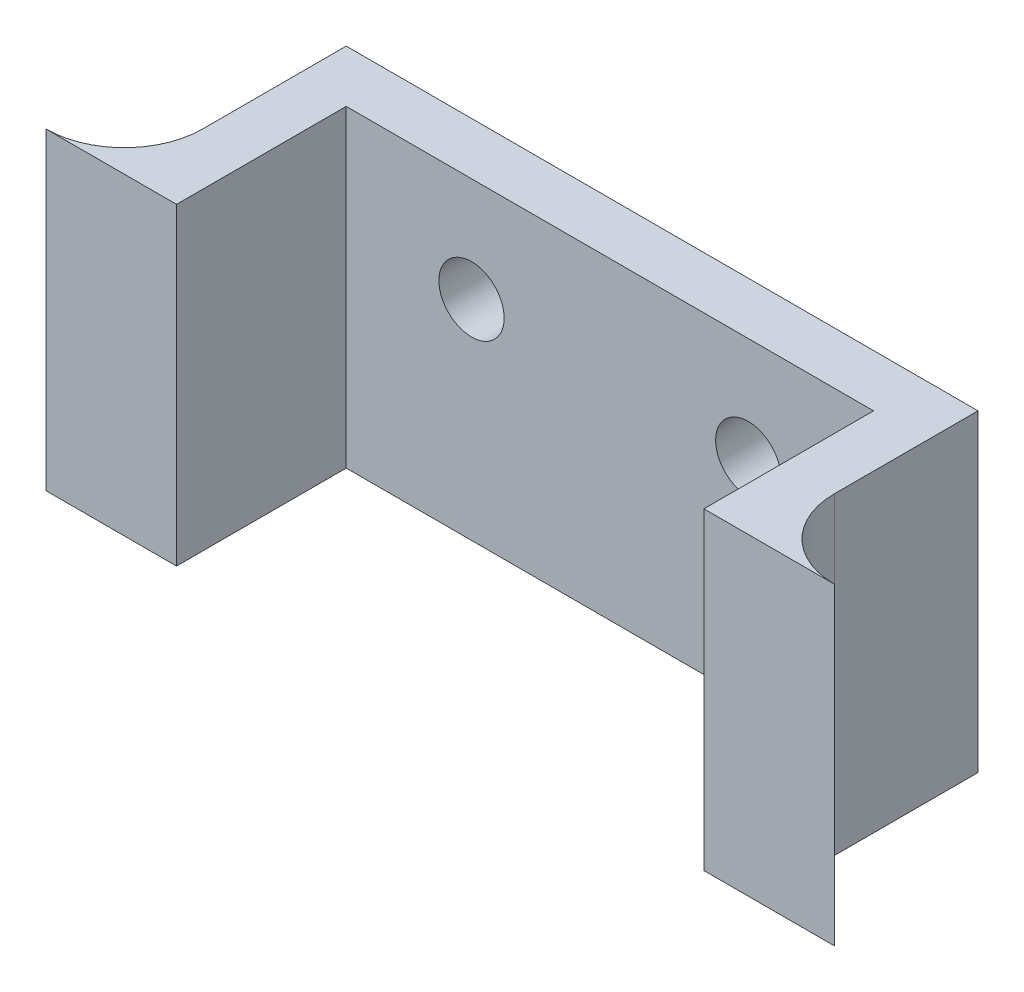
ISO-10303-21;
HEADER;
FILE_DESCRIPTION(('STEP AP214'),'2;1');
FILE_NAME('part.step','',(''),(''),'','','');
FILE_SCHEMA(('AUTOMOTIVE_DESIGN { 1 0 10303 214 1 1 1 1 }'));
ENDSEC;
DATA;
#1=APPLICATION_CONTEXT('core data for automotive mechanical design processes');
#2=APPLICATION_PROTOCOL_DEFINITION('international standard','automotive_design',2000,#1);
#3=PRODUCT_CONTEXT('',#1,'mechanical');
#4=PRODUCT('Part','Part','',(#3));
#5=PRODUCT_RELATED_PRODUCT_CATEGORY('part','',(#4));
#6=PRODUCT_DEFINITION_FORMATION('','',#4);
#7=PRODUCT_DEFINITION_CONTEXT('part definition',#1,'design');
#8=PRODUCT_DEFINITION('design','',#6,#7);
#9=PRODUCT_DEFINITION_SHAPE('','',#8);
#10=(LENGTH_UNIT() NAMED_UNIT(*) SI_UNIT(.MILLI.,.METRE.));
#11=(NAMED_UNIT(*) PLANE_ANGLE_UNIT() SI_UNIT($,.RADIAN.));
#12=(NAMED_UNIT(*) SI_UNIT($,.STERADIAN.) SOLID_ANGLE_UNIT());
#13=UNCERTAINTY_MEASURE_WITH_UNIT(LENGTH_MEASURE(1.E-05),#10,'distance_accuracy_value','');
#14=(GEOMETRIC_REPRESENTATION_CONTEXT(3) GLOBAL_UNCERTAINTY_ASSIGNED_CONTEXT((#13)) GLOBAL_UNIT_ASSIGNED_CONTEXT((#10,
#11,#12)) REPRESENTATION_CONTEXT('',''));
#15=CARTESIAN_POINT('',(0.,0.,0.));
#16=DIRECTION('',(0.,0.,1.));
#17=DIRECTION('',(1.,0.,0.));
#18=AXIS2_PLACEMENT_3D('',#15,#16,#17);
#19=CARTESIAN_POINT('',(10.1,12.,-3.25));
#20=DIRECTION('',(0.,0.,-1.));
#21=DIRECTION('',(-1.,0.,0.));
#22=AXIS2_PLACEMENT_3D('',#19,#20,#21);
#23=PLANE('',#22);
#24=CARTESIAN_POINT('',(5.3,8.,-3.25));
#25=DIRECTION('',(0.,0.,-1.));
#26=DIRECTION('',(-1.,0.,0.));
#27=AXIS2_PLACEMENT_3D('',#24,#25,#26);
#28=CIRCLE('',#27,1.25);
#29=CARTESIAN_POINT('',(4.05,8.,-3.25));
#30=VERTEX_POINT('',#29);
#31=EDGE_CURVE('E151',#30,#30,#28,.F.);
#32=ORIENTED_EDGE('',*,*,#31,.F.);
#33=EDGE_LOOP('',(#32));
#34=FACE_BOUND('',#33,.T.);
#35=CARTESIAN_POINT('',(-5.3,8.,-3.25));
#36=DIRECTION('',(0.,0.,-1.));
#37=DIRECTION('',(-1.,0.,0.));
#38=AXIS2_PLACEMENT_3D('',#35,#36,#37);
#39=CIRCLE('',#38,1.25);
#40=CARTESIAN_POINT('',(-6.55,8.,-3.25));
#41=VERTEX_POINT('',#40);
#42=EDGE_CURVE('E219',#41,#41,#39,.F.);
#43=ORIENTED_EDGE('',*,*,#42,.F.);
#44=EDGE_LOOP('',(#43));
#45=FACE_BOUND('',#44,.T.);
#46=DIRECTION('',(1.,0.,0.));
#47=VECTOR('',#46,1.);
#48=CARTESIAN_POINT('',(10.1,0.,-3.25));
#49=LINE('',#48,#47);
#50=CARTESIAN_POINT('',(-10.1,0.,-3.25));
#51=VERTEX_POINT('',#50);
#52=CARTESIAN_POINT('',(10.1,0.,-3.25));
#53=VERTEX_POINT('',#52);
#54=EDGE_CURVE('E147',#51,#53,#49,.T.);
#55=ORIENTED_EDGE('',*,*,#54,.T.);
#56=DIRECTION('',(0.,-1.,0.));
#57=VECTOR('',#56,1.);
#58=CARTESIAN_POINT('',(10.1,12.,-3.25));
#59=LINE('',#58,#57);
#60=CARTESIAN_POINT('',(10.1,12.,-3.25));
#61=VERTEX_POINT('',#60);
#62=EDGE_CURVE('E11',#61,#53,#59,.T.);
#63=ORIENTED_EDGE('',*,*,#62,.F.);
#64=DIRECTION('',(1.,0.,0.));
#65=VECTOR('',#64,1.);
#66=CARTESIAN_POINT('',(10.1,12.,-3.25));
#67=LINE('',#66,#65);
#68=CARTESIAN_POINT('',(-10.1,12.,-3.25));
#69=VERTEX_POINT('',#68);
#70=EDGE_CURVE('E167',#69,#61,#67,.T.);
#71=ORIENTED_EDGE('',*,*,#70,.F.);
#72=DIRECTION('',(0.,-1.,0.));
#73=VECTOR('',#72,1.);
#74=CARTESIAN_POINT('',(-10.1,12.,-3.25));
#75=LINE('',#74,#73);
#76=EDGE_CURVE('E143',#69,#51,#75,.T.);
#77=ORIENTED_EDGE('',*,*,#76,.T.);
#78=EDGE_LOOP('',(#55,#63,#71,#77));
#79=FACE_BOUND('',#78,.T.);
#80=ADVANCED_FACE('F39',(#34,#45,#79),#23,.F.);
#81=CARTESIAN_POINT('',(10.1,12.,3.25));
#82=DIRECTION('',(1.,0.,0.));
#83=DIRECTION('',(0.,0.,-1.));
#84=AXIS2_PLACEMENT_3D('',#81,#82,#83);
#85=PLANE('',#84);
#86=DIRECTION('',(0.,0.,1.));
#87=VECTOR('',#86,1.);
#88=CARTESIAN_POINT('',(10.1,0.,3.25));
#89=LINE('',#88,#87);
#90=CARTESIAN_POINT('',(10.1,0.,3.25));
#91=VERTEX_POINT('',#90);
#92=EDGE_CURVE('E150',#53,#91,#89,.T.);
#93=ORIENTED_EDGE('',*,*,#92,.T.);
#94=DIRECTION('',(0.,-1.,0.));
#95=VECTOR('',#94,1.);
#96=CARTESIAN_POINT('',(10.1,12.,3.25));
#97=LINE('',#96,#95);
#98=CARTESIAN_POINT('',(10.1,12.,3.25));
#99=VERTEX_POINT('',#98);
#100=EDGE_CURVE('E47',#99,#91,#97,.T.);
#101=ORIENTED_EDGE('',*,*,#100,.F.);
#102=DIRECTION('',(0.,0.,1.));
#103=VECTOR('',#102,1.);
#104=CARTESIAN_POINT('',(10.1,12.,3.25));
#105=LINE('',#104,#103);
#106=EDGE_CURVE('E103',#61,#99,#105,.T.);
#107=ORIENTED_EDGE('',*,*,#106,.F.);
#108=ORIENTED_EDGE('',*,*,#62,.T.);
#109=EDGE_LOOP('',(#93,#101,#107,#108));
#110=FACE_BOUND('',#109,.T.);
#111=ADVANCED_FACE('F188',(#110),#85,.F.);
#112=CARTESIAN_POINT('',(12.1,12.,3.25));
#113=DIRECTION('',(0.,0.,-1.));
#114=DIRECTION('',(-1.,0.,0.));
#115=AXIS2_PLACEMENT_3D('',#112,#113,#114);
#116=PLANE('',#115);
#117=DIRECTION('',(1.,0.,0.));
#118=VECTOR('',#117,1.);
#119=CARTESIAN_POINT('',(12.1,0.,3.25));
#120=LINE('',#119,#118);
#121=CARTESIAN_POINT('',(15.1,0.,3.25));
#122=VERTEX_POINT('',#121);
#123=EDGE_CURVE('E154',#91,#122,#120,.T.);
#124=ORIENTED_EDGE('',*,*,#123,.T.);
#125=DIRECTION('',(0.,-1.,0.));
#126=VECTOR('',#125,1.);
#127=CARTESIAN_POINT('',(15.1,12.,3.25));
#128=LINE('',#127,#126);
#129=CARTESIAN_POINT('',(15.1,12.,3.25));
#130=VERTEX_POINT('',#129);
#131=EDGE_CURVE('E180',#130,#122,#128,.T.);
#132=ORIENTED_EDGE('',*,*,#131,.F.);
#133=DIRECTION('',(1.,0.,0.));
#134=VECTOR('',#133,1.);
#135=CARTESIAN_POINT('',(12.1,12.,3.25));
#136=LINE('',#135,#134);
#137=EDGE_CURVE('E187',#99,#130,#136,.T.);
#138=ORIENTED_EDGE('',*,*,#137,.F.);
#139=ORIENTED_EDGE('',*,*,#100,.T.);
#140=EDGE_LOOP('',(#124,#132,#138,#139));
#141=FACE_BOUND('',#140,.T.);
#142=ADVANCED_FACE('F185',(#141),#116,.F.);
#143=CARTESIAN_POINT('',(15.1,12.,0.25));
#144=DIRECTION('',(0.,-1.,0.));
#145=DIRECTION('',(0.,0.,-1.));
#146=AXIS2_PLACEMENT_3D('',#143,#144,#145);
#147=CYLINDRICAL_SURFACE('',#146,3.);
#148=CARTESIAN_POINT('',(15.1,0.,0.25));
#149=DIRECTION('',(0.,-1.,0.));
#150=DIRECTION('',(0.,0.,-1.));
#151=AXIS2_PLACEMENT_3D('',#148,#149,#150);
#152=CIRCLE('',#151,3.);
#153=CARTESIAN_POINT('',(12.1,0.,0.249999999999978));
#154=VERTEX_POINT('',#153);
#155=EDGE_CURVE('E156',#122,#154,#152,.T.);
#156=ORIENTED_EDGE('',*,*,#155,.T.);
#157=DIRECTION('',(0.,-1.,0.));
#158=VECTOR('',#157,1.);
#159=CARTESIAN_POINT('',(12.1,12.,0.249999999999978));
#160=LINE('',#159,#158);
#161=CARTESIAN_POINT('',(12.1,12.,0.249999999999978));
#162=VERTEX_POINT('',#161);
#163=EDGE_CURVE('E177',#162,#154,#160,.T.);
#164=ORIENTED_EDGE('',*,*,#163,.F.);
#165=CARTESIAN_POINT('',(15.1,12.,0.25));
#166=DIRECTION('',(0.,-1.,0.));
#167=DIRECTION('',(0.,0.,-1.));
#168=AXIS2_PLACEMENT_3D('',#165,#166,#167);
#169=CIRCLE('',#168,3.);
#170=EDGE_CURVE('E207',#130,#162,#169,.T.);
#171=ORIENTED_EDGE('',*,*,#170,.F.);
#172=ORIENTED_EDGE('',*,*,#131,.T.);
#173=EDGE_LOOP('',(#156,#164,#171,#172));
#174=FACE_BOUND('',#173,.T.);
#175=ADVANCED_FACE('F198',(#174),#147,.F.);
#176=CARTESIAN_POINT('',(12.1,12.,-5.25));
#177=DIRECTION('',(-1.,0.,0.));
#178=DIRECTION('',(0.,0.,1.));
#179=AXIS2_PLACEMENT_3D('',#176,#177,#178);
#180=PLANE('',#179);
#181=DIRECTION('',(0.,0.,-1.));
#182=VECTOR('',#181,1.);
#183=CARTESIAN_POINT('',(12.1,0.,-5.25));
#184=LINE('',#183,#182);
#185=CARTESIAN_POINT('',(12.1,0.,-5.25));
#186=VERTEX_POINT('',#185);
#187=EDGE_CURVE('E158',#154,#186,#184,.T.);
#188=ORIENTED_EDGE('',*,*,#187,.T.);
#189=DIRECTION('',(0.,-1.,0.));
#190=VECTOR('',#189,1.);
#191=CARTESIAN_POINT('',(12.1,12.,-5.25));
#192=LINE('',#191,#190);
#193=CARTESIAN_POINT('',(12.1,12.,-5.25));
#194=VERTEX_POINT('',#193);
#195=EDGE_CURVE('E174',#194,#186,#192,.T.);
#196=ORIENTED_EDGE('',*,*,#195,.F.);
#197=DIRECTION('',(0.,0.,-1.));
#198=VECTOR('',#197,1.);
#199=CARTESIAN_POINT('',(12.1,12.,-5.25));
#200=LINE('',#199,#198);
#201=EDGE_CURVE('E204',#162,#194,#200,.T.);
#202=ORIENTED_EDGE('',*,*,#201,.F.);
#203=ORIENTED_EDGE('',*,*,#163,.T.);
#204=EDGE_LOOP('',(#188,#196,#202,#203));
#205=FACE_BOUND('',#204,.T.);
#206=ADVANCED_FACE('F202',(#205),#180,.F.);
#207=CARTESIAN_POINT('',(-12.1,12.,-5.25));
#208=DIRECTION('',(0.,0.,1.));
#209=DIRECTION('',(1.,0.,0.));
#210=AXIS2_PLACEMENT_3D('',#207,#208,#209);
#211=PLANE('',#210);
#212=CARTESIAN_POINT('',(5.3,8.,-5.25));
#213=DIRECTION('',(0.,0.,-1.));
#214=DIRECTION('',(-1.,0.,0.));
#215=AXIS2_PLACEMENT_3D('',#212,#213,#214);
#216=CIRCLE('',#215,1.25);
#217=CARTESIAN_POINT('',(4.05,8.,-5.25));
#218=VERTEX_POINT('',#217);
#219=EDGE_CURVE('E218',#218,#218,#216,.T.);
#220=ORIENTED_EDGE('',*,*,#219,.F.);
#221=EDGE_LOOP('',(#220));
#222=FACE_BOUND('',#221,.T.);
#223=CARTESIAN_POINT('',(-5.3,8.,-5.25));
#224=DIRECTION('',(0.,0.,-1.));
#225=DIRECTION('',(1.,0.,0.));
#226=AXIS2_PLACEMENT_3D('',#223,#224,#225);
#227=CIRCLE('',#226,1.25);
#228=CARTESIAN_POINT('',(-4.05,8.,-5.25));
#229=VERTEX_POINT('',#228);
#230=EDGE_CURVE('E215',#229,#229,#227,.T.);
#231=ORIENTED_EDGE('',*,*,#230,.F.);
#232=EDGE_LOOP('',(#231));
#233=FACE_BOUND('',#232,.T.);
#234=DIRECTION('',(-1.,0.,0.));
#235=VECTOR('',#234,1.);
#236=CARTESIAN_POINT('',(-12.1,0.,-5.25));
#237=LINE('',#236,#235);
#238=CARTESIAN_POINT('',(-12.1,0.,-5.25));
#239=VERTEX_POINT('',#238);
#240=EDGE_CURVE('E160',#186,#239,#237,.T.);
#241=ORIENTED_EDGE('',*,*,#240,.T.);
#242=DIRECTION('',(0.,-1.,0.));
#243=VECTOR('',#242,1.);
#244=CARTESIAN_POINT('',(-12.1,12.,-5.25));
#245=LINE('',#244,#243);
#246=CARTESIAN_POINT('',(-12.1,12.,-5.25));
#247=VERTEX_POINT('',#246);
#248=EDGE_CURVE('E171',#247,#239,#245,.T.);
#249=ORIENTED_EDGE('',*,*,#248,.F.);
#250=DIRECTION('',(-1.,0.,0.));
#251=VECTOR('',#250,1.);
#252=CARTESIAN_POINT('',(-12.1,12.,-5.25));
#253=LINE('',#252,#251);
#254=EDGE_CURVE('E206',#194,#247,#253,.T.);
#255=ORIENTED_EDGE('',*,*,#254,.F.);
#256=ORIENTED_EDGE('',*,*,#195,.T.);
#257=EDGE_LOOP('',(#241,#249,#255,#256));
#258=FACE_BOUND('',#257,.T.);
#259=ADVANCED_FACE('F230',(#222,#233,#258),#211,.F.);
#260=CARTESIAN_POINT('',(-12.1,12.,-5.25));
#261=DIRECTION('',(1.,0.,0.));
#262=DIRECTION('',(0.,0.,-1.));
#263=AXIS2_PLACEMENT_3D('',#260,#261,#262);
#264=PLANE('',#263);
#265=DIRECTION('',(0.,0.,1.));
#266=VECTOR('',#265,1.);
#267=CARTESIAN_POINT('',(-12.1,0.,-5.25));
#268=LINE('',#267,#266);
#269=CARTESIAN_POINT('',(-12.1,0.,0.249999999999979));
#270=VERTEX_POINT('',#269);
#271=EDGE_CURVE('E162',#239,#270,#268,.T.);
#272=ORIENTED_EDGE('',*,*,#271,.T.);
#273=DIRECTION('',(0.,-1.,0.));
#274=VECTOR('',#273,1.);
#275=CARTESIAN_POINT('',(-12.1,12.,0.249999999999979));
#276=LINE('',#275,#274);
#277=CARTESIAN_POINT('',(-12.1,12.,0.249999999999979));
#278=VERTEX_POINT('',#277);
#279=EDGE_CURVE('E138',#278,#270,#276,.T.);
#280=ORIENTED_EDGE('',*,*,#279,.F.);
#281=DIRECTION('',(0.,0.,1.));
#282=VECTOR('',#281,1.);
#283=CARTESIAN_POINT('',(-12.1,12.,-5.25));
#284=LINE('',#283,#282);
#285=EDGE_CURVE('E128',#247,#278,#284,.T.);
#286=ORIENTED_EDGE('',*,*,#285,.F.);
#287=ORIENTED_EDGE('',*,*,#248,.T.);
#288=EDGE_LOOP('',(#272,#280,#286,#287));
#289=FACE_BOUND('',#288,.T.);
#290=ADVANCED_FACE('F233',(#289),#264,.F.);
#291=CARTESIAN_POINT('',(-15.1,12.,0.25));
#292=DIRECTION('',(0.,-1.,0.));
#293=DIRECTION('',(0.,0.,-1.));
#294=AXIS2_PLACEMENT_3D('',#291,#292,#293);
#295=CYLINDRICAL_SURFACE('',#294,3.);
#296=CARTESIAN_POINT('',(-15.1,0.,0.25));
#297=DIRECTION('',(0.,-1.,0.));
#298=DIRECTION('',(0.,0.,-1.));
#299=AXIS2_PLACEMENT_3D('',#296,#297,#298);
#300=CIRCLE('',#299,3.);
#301=CARTESIAN_POINT('',(-15.1,0.,3.25));
#302=VERTEX_POINT('',#301);
#303=EDGE_CURVE('E137',#270,#302,#300,.T.);
#304=ORIENTED_EDGE('',*,*,#303,.T.);
#305=DIRECTION('',(0.,-1.,0.));
#306=VECTOR('',#305,1.);
#307=CARTESIAN_POINT('',(-15.1,12.,3.25));
#308=LINE('',#307,#306);
#309=CARTESIAN_POINT('',(-15.1,12.,3.25));
#310=VERTEX_POINT('',#309);
#311=EDGE_CURVE('E134',#310,#302,#308,.T.);
#312=ORIENTED_EDGE('',*,*,#311,.F.);
#313=CARTESIAN_POINT('',(-15.1,12.,0.25));
#314=DIRECTION('',(0.,-1.,0.));
#315=DIRECTION('',(0.,0.,-1.));
#316=AXIS2_PLACEMENT_3D('',#313,#314,#315);
#317=CIRCLE('',#316,3.);
#318=EDGE_CURVE('E122',#278,#310,#317,.T.);
#319=ORIENTED_EDGE('',*,*,#318,.F.);
#320=ORIENTED_EDGE('',*,*,#279,.T.);
#321=EDGE_LOOP('',(#304,#312,#319,#320));
#322=FACE_BOUND('',#321,.T.);
#323=ADVANCED_FACE('F135',(#322),#295,.F.);
#324=CARTESIAN_POINT('',(-12.1,12.,3.25));
#325=DIRECTION('',(0.,0.,-1.));
#326=DIRECTION('',(-1.,0.,0.));
#327=AXIS2_PLACEMENT_3D('',#324,#325,#326);
#328=PLANE('',#327);
#329=DIRECTION('',(1.,0.,0.));
#330=VECTOR('',#329,1.);
#331=CARTESIAN_POINT('',(-12.1,0.,3.25));
#332=LINE('',#331,#330);
#333=CARTESIAN_POINT('',(-10.1,0.,3.25));
#334=VERTEX_POINT('',#333);
#335=EDGE_CURVE('E89',#302,#334,#332,.T.);
#336=ORIENTED_EDGE('',*,*,#335,.T.);
#337=DIRECTION('',(0.,-1.,0.));
#338=VECTOR('',#337,1.);
#339=CARTESIAN_POINT('',(-10.1,12.,3.25));
#340=LINE('',#339,#338);
#341=CARTESIAN_POINT('',(-10.1,12.,3.25));
#342=VERTEX_POINT('',#341);
#343=EDGE_CURVE('E139',#342,#334,#340,.T.);
#344=ORIENTED_EDGE('',*,*,#343,.F.);
#345=DIRECTION('',(1.,0.,0.));
#346=VECTOR('',#345,1.);
#347=CARTESIAN_POINT('',(-15.1,12.,3.25));
#348=LINE('',#347,#346);
#349=EDGE_CURVE('E126',#310,#342,#348,.T.);
#350=ORIENTED_EDGE('',*,*,#349,.F.);
#351=ORIENTED_EDGE('',*,*,#311,.T.);
#352=EDGE_LOOP('',(#336,#344,#350,#351));
#353=FACE_BOUND('',#352,.T.);
#354=ADVANCED_FACE('F141',(#353),#328,.F.);
#355=CARTESIAN_POINT('',(-10.1,12.,-3.25));
#356=DIRECTION('',(-1.,0.,0.));
#357=DIRECTION('',(0.,0.,1.));
#358=AXIS2_PLACEMENT_3D('',#355,#356,#357);
#359=PLANE('',#358);
#360=DIRECTION('',(0.,0.,-1.));
#361=VECTOR('',#360,1.);
#362=CARTESIAN_POINT('',(-10.1,0.,-3.25));
#363=LINE('',#362,#361);
#364=EDGE_CURVE('E95',#334,#51,#363,.T.);
#365=ORIENTED_EDGE('',*,*,#364,.T.);
#366=ORIENTED_EDGE('',*,*,#76,.F.);
#367=DIRECTION('',(0.,0.,-1.));
#368=VECTOR('',#367,1.);
#369=CARTESIAN_POINT('',(-10.1,12.,-3.25));
#370=LINE('',#369,#368);
#371=EDGE_CURVE('E55',#342,#69,#370,.T.);
#372=ORIENTED_EDGE('',*,*,#371,.F.);
#373=ORIENTED_EDGE('',*,*,#343,.T.);
#374=EDGE_LOOP('',(#365,#366,#372,#373));
#375=FACE_BOUND('',#374,.T.);
#376=ADVANCED_FACE('F256',(#375),#359,.F.);
#377=CARTESIAN_POINT('',(-15.1,12.,0.25));
#378=DIRECTION('',(0.,-1.,0.));
#379=DIRECTION('',(0.,0.,-1.));
#380=AXIS2_PLACEMENT_3D('',#377,#378,#379);
#381=PLANE('',#380);
#382=ORIENTED_EDGE('',*,*,#70,.T.);
#383=ORIENTED_EDGE('',*,*,#106,.T.);
#384=ORIENTED_EDGE('',*,*,#137,.T.);
#385=ORIENTED_EDGE('',*,*,#170,.T.);
#386=ORIENTED_EDGE('',*,*,#201,.T.);
#387=ORIENTED_EDGE('',*,*,#254,.T.);
#388=ORIENTED_EDGE('',*,*,#285,.T.);
#389=ORIENTED_EDGE('',*,*,#318,.T.);
#390=ORIENTED_EDGE('',*,*,#349,.T.);
#391=ORIENTED_EDGE('',*,*,#371,.T.);
#392=EDGE_LOOP('',(#382,#383,#384,#385,#386,#387,#388,#389,#390,#391));
#393=FACE_BOUND('',#392,.T.);
#394=ADVANCED_FACE('F124',(#393),#381,.F.);
#395=CARTESIAN_POINT('',(-15.1,0.,0.25));
#396=DIRECTION('',(0.,-1.,0.));
#397=DIRECTION('',(0.,0.,-1.));
#398=AXIS2_PLACEMENT_3D('',#395,#396,#397);
#399=PLANE('',#398);
#400=ORIENTED_EDGE('',*,*,#54,.F.);
#401=ORIENTED_EDGE('',*,*,#364,.F.);
#402=ORIENTED_EDGE('',*,*,#335,.F.);
#403=ORIENTED_EDGE('',*,*,#303,.F.);
#404=ORIENTED_EDGE('',*,*,#271,.F.);
#405=ORIENTED_EDGE('',*,*,#240,.F.);
#406=ORIENTED_EDGE('',*,*,#187,.F.);
#407=ORIENTED_EDGE('',*,*,#155,.F.);
#408=ORIENTED_EDGE('',*,*,#123,.F.);
#409=ORIENTED_EDGE('',*,*,#92,.F.);
#410=EDGE_LOOP('',(#400,#401,#402,#403,#404,#405,#406,#407,#408,#409));
#411=FACE_BOUND('',#410,.T.);
#412=ADVANCED_FACE('F192',(#411),#399,.T.);
#413=CARTESIAN_POINT('',(-5.3,8.,3.251));
#414=DIRECTION('',(0.,0.,-1.));
#415=DIRECTION('',(-1.,0.,0.));
#416=AXIS2_PLACEMENT_3D('',#413,#414,#415);
#417=CYLINDRICAL_SURFACE('',#416,1.25);
#418=ORIENTED_EDGE('',*,*,#230,.T.);
#419=EDGE_LOOP('',(#418));
#420=FACE_BOUND('',#419,.T.);
#421=ORIENTED_EDGE('',*,*,#42,.T.);
#422=EDGE_LOOP('',(#421));
#423=FACE_BOUND('',#422,.T.);
#424=ADVANCED_FACE('F267',(#420,#423),#417,.F.);
#425=CARTESIAN_POINT('',(5.3,8.,3.251));
#426=DIRECTION('',(0.,0.,-1.));
#427=DIRECTION('',(-1.,0.,0.));
#428=AXIS2_PLACEMENT_3D('',#425,#426,#427);
#429=CYLINDRICAL_SURFACE('',#428,1.25);
#430=ORIENTED_EDGE('',*,*,#219,.T.);
#431=EDGE_LOOP('',(#430));
#432=FACE_BOUND('',#431,.T.);
#433=ORIENTED_EDGE('',*,*,#31,.T.);
#434=EDGE_LOOP('',(#433));
#435=FACE_BOUND('',#434,.T.);
#436=ADVANCED_FACE('F227',(#432,#435),#429,.F.);
#437=CLOSED_SHELL('',(#80,#111,#142,#175,#206,#259,#290,#323,#354,#376,#394,#412,#424,#436));
#438=MANIFOLD_SOLID_BREP('B2',#437);
#439=ADVANCED_BREP_SHAPE_REPRESENTATION('',(#18,#438),#14);
#440=SHAPE_DEFINITION_REPRESENTATION(#9,#439);
ENDSEC;
END-ISO-10303-21;
